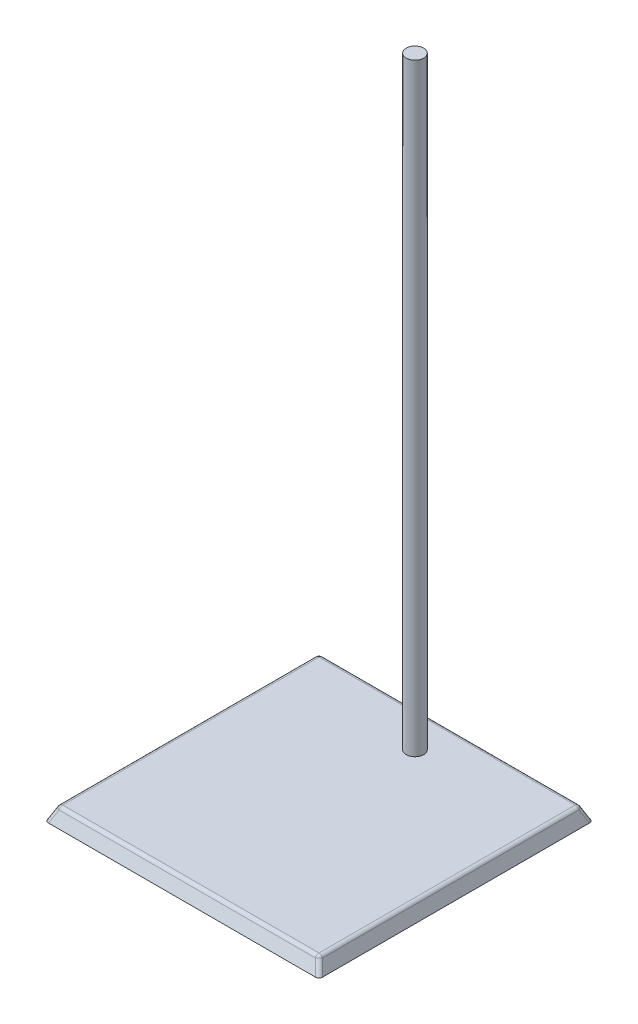
ISO-10303-21;
HEADER;
FILE_DESCRIPTION(('STEP AP214'),'2;1');
FILE_NAME('part.step','',(''),(''),'','','');
FILE_SCHEMA(('AUTOMOTIVE_DESIGN { 1 0 10303 214 1 1 1 1 }'));
ENDSEC;
DATA;
#1=APPLICATION_CONTEXT('core data for automotive mechanical design processes');
#2=APPLICATION_PROTOCOL_DEFINITION('international standard','automotive_design',2000,#1);
#3=PRODUCT_CONTEXT('',#1,'mechanical');
#4=PRODUCT('Part','Part','',(#3));
#5=PRODUCT_RELATED_PRODUCT_CATEGORY('part','',(#4));
#6=PRODUCT_DEFINITION_FORMATION('','',#4);
#7=PRODUCT_DEFINITION_CONTEXT('part definition',#1,'design');
#8=PRODUCT_DEFINITION('design','',#6,#7);
#9=PRODUCT_DEFINITION_SHAPE('','',#8);
#10=(LENGTH_UNIT() NAMED_UNIT(*) SI_UNIT(.MILLI.,.METRE.));
#11=(NAMED_UNIT(*) PLANE_ANGLE_UNIT() SI_UNIT($,.RADIAN.));
#12=(NAMED_UNIT(*) SI_UNIT($,.STERADIAN.) SOLID_ANGLE_UNIT());
#13=UNCERTAINTY_MEASURE_WITH_UNIT(LENGTH_MEASURE(1.E-05),#10,'distance_accuracy_value','');
#14=(GEOMETRIC_REPRESENTATION_CONTEXT(3) GLOBAL_UNCERTAINTY_ASSIGNED_CONTEXT((#13)) GLOBAL_UNIT_ASSIGNED_CONTEXT((#10,
#11,#12)) REPRESENTATION_CONTEXT('',''));
#15=CARTESIAN_POINT('',(0.,0.,0.));
#16=DIRECTION('',(0.,0.,1.));
#17=DIRECTION('',(1.,0.,0.));
#18=AXIS2_PLACEMENT_3D('',#15,#16,#17);
#19=CARTESIAN_POINT('',(0.,450.,0.));
#20=DIRECTION('',(0.,-1.,0.));
#21=DIRECTION('',(0.,0.,-1.));
#22=AXIS2_PLACEMENT_3D('',#19,#20,#21);
#23=CYLINDRICAL_SURFACE('',#22,6.35);
#24=CARTESIAN_POINT('',(0.,10.,0.));
#25=DIRECTION('',(0.,1.,0.));
#26=DIRECTION('',(0.,0.,1.));
#27=AXIS2_PLACEMENT_3D('',#24,#25,#26);
#28=CIRCLE('',#27,6.35);
#29=CARTESIAN_POINT('',(0.,10.,6.35));
#30=VERTEX_POINT('',#29);
#31=EDGE_CURVE('E154',#30,#30,#28,.T.);
#32=ORIENTED_EDGE('',*,*,#31,.T.);
#33=EDGE_LOOP('',(#32));
#34=FACE_BOUND('',#33,.T.);
#35=CARTESIAN_POINT('',(0.,450.,0.));
#36=DIRECTION('',(0.,1.,0.));
#37=DIRECTION('',(0.,0.,1.));
#38=AXIS2_PLACEMENT_3D('',#35,#36,#37);
#39=CIRCLE('',#38,6.35);
#40=CARTESIAN_POINT('',(0.,450.,6.35));
#41=VERTEX_POINT('',#40);
#42=EDGE_CURVE('E155',#41,#41,#39,.T.);
#43=ORIENTED_EDGE('',*,*,#42,.F.);
#44=EDGE_LOOP('',(#43));
#45=FACE_BOUND('',#44,.T.);
#46=ADVANCED_FACE('F35',(#34,#45),#23,.T.);
#47=CARTESIAN_POINT('',(0.,450.,0.));
#48=DIRECTION('',(0.,1.,0.));
#49=DIRECTION('',(0.,0.,1.));
#50=AXIS2_PLACEMENT_3D('',#47,#48,#49);
#51=PLANE('',#50);
#52=ORIENTED_EDGE('',*,*,#42,.T.);
#53=EDGE_LOOP('',(#52));
#54=FACE_BOUND('',#53,.T.);
#55=ADVANCED_FACE('F269',(#54),#51,.T.);
#56=CARTESIAN_POINT('',(0.,10.,0.));
#57=DIRECTION('',(0.,1.,0.));
#58=DIRECTION('',(0.,0.,1.));
#59=AXIS2_PLACEMENT_3D('',#56,#57,#58);
#60=PLANE('',#59);
#61=DIRECTION('',(0.,0.,-1.));
#62=VECTOR('',#61,1.);
#63=CARTESIAN_POINT('',(93.4257126360275,10.,0.));
#64=LINE('',#63,#62);
#65=CARTESIAN_POINT('',(93.4257126360275,10.,163.425712636027));
#66=VERTEX_POINT('',#65);
#67=CARTESIAN_POINT('',(93.4257126360275,10.,-23.4257126360276));
#68=VERTEX_POINT('',#67);
#69=EDGE_CURVE('E181',#66,#68,#64,.T.);
#70=ORIENTED_EDGE('',*,*,#69,.T.);
#71=DIRECTION('',(-1.,0.,0.));
#72=VECTOR('',#71,1.);
#73=CARTESIAN_POINT('',(0.,10.,-23.4257126360275));
#74=LINE('',#73,#72);
#75=CARTESIAN_POINT('',(-93.4257126360275,10.,-23.4257126360275));
#76=VERTEX_POINT('',#75);
#77=EDGE_CURVE('E11',#68,#76,#74,.T.);
#78=ORIENTED_EDGE('',*,*,#77,.T.);
#79=DIRECTION('',(0.,0.,1.));
#80=VECTOR('',#79,1.);
#81=CARTESIAN_POINT('',(-93.4257126360275,10.,0.));
#82=LINE('',#81,#80);
#83=CARTESIAN_POINT('',(-93.4257126360275,10.,163.425712636028));
#84=VERTEX_POINT('',#83);
#85=EDGE_CURVE('E44',#76,#84,#82,.T.);
#86=ORIENTED_EDGE('',*,*,#85,.T.);
#87=DIRECTION('',(1.,0.,0.));
#88=VECTOR('',#87,1.);
#89=CARTESIAN_POINT('',(0.,10.,163.425712636028));
#90=LINE('',#89,#88);
#91=EDGE_CURVE('E183',#84,#66,#90,.T.);
#92=ORIENTED_EDGE('',*,*,#91,.T.);
#93=EDGE_LOOP('',(#70,#78,#86,#92));
#94=FACE_BOUND('',#93,.T.);
#95=ORIENTED_EDGE('',*,*,#31,.F.);
#96=EDGE_LOOP('',(#95));
#97=FACE_BOUND('',#96,.T.);
#98=ADVANCED_FACE('F243',(#94,#97),#60,.T.);
#99=CARTESIAN_POINT('',(0.,0.,0.));
#100=DIRECTION('',(0.,1.,0.));
#101=DIRECTION('',(0.,0.,1.));
#102=AXIS2_PLACEMENT_3D('',#99,#100,#101);
#103=PLANE('',#102);
#104=DIRECTION('',(0.,0.,1.));
#105=VECTOR('',#104,1.);
#106=CARTESIAN_POINT('',(-100.,0.,170.));
#107=LINE('',#106,#105);
#108=CARTESIAN_POINT('',(-100.,0.,-27.28107663889));
#109=VERTEX_POINT('',#108);
#110=CARTESIAN_POINT('',(-100.,0.,167.28107663889));
#111=VERTEX_POINT('',#110);
#112=EDGE_CURVE('E131',#109,#111,#107,.T.);
#113=ORIENTED_EDGE('',*,*,#112,.F.);
#114=CARTESIAN_POINT('',(-96.6898662431125,0.,-26.6898662431125));
#115=DIRECTION('',(0.,1.,0.));
#116=DIRECTION('',(-0.707106781186548,0.,-0.707106781186547));
#117=AXIS2_PLACEMENT_3D('',#114,#115,#116);
#118=ELLIPSE('',#117,3.59360139372356,3.);
#119=CARTESIAN_POINT('',(-97.28107663889,0.,-30.));
#120=VERTEX_POINT('',#119);
#121=EDGE_CURVE('E115',#109,#120,#118,.F.);
#122=ORIENTED_EDGE('',*,*,#121,.T.);
#123=DIRECTION('',(-1.,0.,0.));
#124=VECTOR('',#123,1.);
#125=CARTESIAN_POINT('',(100.,0.,-30.));
#126=LINE('',#125,#124);
#127=CARTESIAN_POINT('',(97.28107663889,0.,-30.));
#128=VERTEX_POINT('',#127);
#129=EDGE_CURVE('E152',#128,#120,#126,.T.);
#130=ORIENTED_EDGE('',*,*,#129,.F.);
#131=CARTESIAN_POINT('',(96.6898662431125,0.,-26.6898662431125));
#132=DIRECTION('',(0.,1.,0.));
#133=DIRECTION('',(0.707106781186547,0.,-0.707106781186548));
#134=AXIS2_PLACEMENT_3D('',#131,#132,#133);
#135=ELLIPSE('',#134,3.59360139372356,3.);
#136=CARTESIAN_POINT('',(100.,0.,-27.2810766388901));
#137=VERTEX_POINT('',#136);
#138=EDGE_CURVE('E126',#128,#137,#135,.F.);
#139=ORIENTED_EDGE('',*,*,#138,.T.);
#140=DIRECTION('',(0.,0.,-1.));
#141=VECTOR('',#140,1.);
#142=CARTESIAN_POINT('',(100.,0.,170.));
#143=LINE('',#142,#141);
#144=CARTESIAN_POINT('',(100.,0.,167.28107663889));
#145=VERTEX_POINT('',#144);
#146=EDGE_CURVE('E145',#145,#137,#143,.T.);
#147=ORIENTED_EDGE('',*,*,#146,.F.);
#148=CARTESIAN_POINT('',(96.6898662431125,0.,166.689866243113));
#149=DIRECTION('',(0.,1.,0.));
#150=DIRECTION('',(-0.707106781186548,0.,-0.707106781186547));
#151=AXIS2_PLACEMENT_3D('',#148,#149,#150);
#152=ELLIPSE('',#151,3.59360139372356,3.);
#153=CARTESIAN_POINT('',(97.28107663889,0.,170.));
#154=VERTEX_POINT('',#153);
#155=EDGE_CURVE('E135',#145,#154,#152,.F.);
#156=ORIENTED_EDGE('',*,*,#155,.T.);
#157=DIRECTION('',(1.,0.,0.));
#158=VECTOR('',#157,1.);
#159=CARTESIAN_POINT('',(100.,0.,170.));
#160=LINE('',#159,#158);
#161=CARTESIAN_POINT('',(-97.28107663889,0.,170.));
#162=VERTEX_POINT('',#161);
#163=EDGE_CURVE('E142',#162,#154,#160,.T.);
#164=ORIENTED_EDGE('',*,*,#163,.F.);
#165=CARTESIAN_POINT('',(-96.6898662431125,0.,166.689866243113));
#166=DIRECTION('',(0.,1.,0.));
#167=DIRECTION('',(0.707106781186547,0.,-0.707106781186548));
#168=AXIS2_PLACEMENT_3D('',#165,#166,#167);
#169=ELLIPSE('',#168,3.59360139372356,3.);
#170=EDGE_CURVE('E141',#162,#111,#169,.F.);
#171=ORIENTED_EDGE('',*,*,#170,.T.);
#172=EDGE_LOOP('',(#113,#122,#130,#139,#147,#156,#164,#171));
#173=FACE_BOUND('',#172,.T.);
#174=ADVANCED_FACE('F138',(#173),#103,.F.);
#175=CARTESIAN_POINT('',(95.33692341845,10.,0.));
#176=DIRECTION('',(0.906307787036651,0.422618261740697,0.));
#177=DIRECTION('',(0.,0.,1.));
#178=AXIS2_PLACEMENT_3D('',#175,#176,#177);
#179=PLANE('',#178);
#180=ORIENTED_EDGE('',*,*,#146,.T.);
#181=DIRECTION('',(0.389281620635024,-0.834817129478989,-0.389281620635024));
#182=VECTOR('',#181,1.);
#183=CARTESIAN_POINT('',(91.9093876148061,17.3503742512087,-19.1904642536962));
#184=LINE('',#183,#182);
#185=CARTESIAN_POINT('',(96.1446359971375,8.2678547852221,-23.4257126360276));
#186=VERTEX_POINT('',#185);
#187=EDGE_CURVE('E173',#137,#186,#184,.F.);
#188=ORIENTED_EDGE('',*,*,#187,.T.);
#189=DIRECTION('',(0.,0.,-1.));
#190=VECTOR('',#189,1.);
#191=CARTESIAN_POINT('',(96.1446359971375,8.2678547852221,0.));
#192=LINE('',#191,#190);
#193=CARTESIAN_POINT('',(96.1446359971375,8.2678547852221,163.425712636028));
#194=VERTEX_POINT('',#193);
#195=EDGE_CURVE('E169',#186,#194,#192,.F.);
#196=ORIENTED_EDGE('',*,*,#195,.T.);
#197=DIRECTION('',(-0.389281620635023,0.834817129478989,-0.389281620635023));
#198=VECTOR('',#197,1.);
#199=CARTESIAN_POINT('',(70.6937623918139,62.8474293648529,137.974839030704));
#200=LINE('',#199,#198);
#201=EDGE_CURVE('E171',#194,#145,#200,.F.);
#202=ORIENTED_EDGE('',*,*,#201,.T.);
#203=EDGE_LOOP('',(#180,#188,#196,#202));
#204=FACE_BOUND('',#203,.T.);
#205=ADVANCED_FACE('F230',(#204),#179,.T.);
#206=CARTESIAN_POINT('',(0.,10.,-25.33692341845));
#207=DIRECTION('',(0.,0.422618261740697,-0.906307787036651));
#208=DIRECTION('',(1.,0.,0.));
#209=AXIS2_PLACEMENT_3D('',#206,#207,#208);
#210=PLANE('',#209);
#211=ORIENTED_EDGE('',*,*,#129,.T.);
#212=DIRECTION('',(-0.389281620635023,-0.834817129478989,-0.389281620635023));
#213=VECTOR('',#212,1.);
#214=CARTESIAN_POINT('',(-78.5826516422001,40.0989018080308,-11.30157500331));
#215=LINE('',#214,#213);
#216=CARTESIAN_POINT('',(-93.4257126360275,8.26785478522209,-26.1446359971375));
#217=VERTEX_POINT('',#216);
#218=EDGE_CURVE('E120',#120,#217,#215,.F.);
#219=ORIENTED_EDGE('',*,*,#218,.T.);
#220=DIRECTION('',(-1.,0.,0.));
#221=VECTOR('',#220,1.);
#222=CARTESIAN_POINT('',(0.,8.26785478522209,-26.1446359971375));
#223=LINE('',#222,#221);
#224=CARTESIAN_POINT('',(93.4257126360275,8.26785478522209,-26.1446359971375));
#225=VERTEX_POINT('',#224);
#226=EDGE_CURVE('E125',#217,#225,#223,.F.);
#227=ORIENTED_EDGE('',*,*,#226,.T.);
#228=DIRECTION('',(0.389281620635024,-0.834817129478989,-0.389281620635024));
#229=VECTOR('',#228,1.);
#230=CARTESIAN_POINT('',(78.5826516422001,40.0989018080308,-11.30157500331));
#231=LINE('',#230,#229);
#232=EDGE_CURVE('E166',#225,#128,#231,.T.);
#233=ORIENTED_EDGE('',*,*,#232,.T.);
#234=EDGE_LOOP('',(#211,#219,#227,#233));
#235=FACE_BOUND('',#234,.T.);
#236=ADVANCED_FACE('F284',(#235),#210,.T.);
#237=CARTESIAN_POINT('',(0.,10.,165.33692341845));
#238=DIRECTION('',(0.,0.422618261740697,0.906307787036651));
#239=DIRECTION('',(-1.,0.,0.));
#240=AXIS2_PLACEMENT_3D('',#237,#238,#239);
#241=PLANE('',#240);
#242=DIRECTION('',(1.,0.,0.));
#243=VECTOR('',#242,1.);
#244=CARTESIAN_POINT('',(0.,8.2678547852221,166.144635997138));
#245=LINE('',#244,#243);
#246=CARTESIAN_POINT('',(93.4257126360275,8.2678547852221,166.144635997137));
#247=VERTEX_POINT('',#246);
#248=CARTESIAN_POINT('',(-93.4257126360276,8.2678547852221,166.144635997138));
#249=VERTEX_POINT('',#248);
#250=EDGE_CURVE('E175',#247,#249,#245,.F.);
#251=ORIENTED_EDGE('',*,*,#250,.T.);
#252=DIRECTION('',(0.389281620635023,0.834817129478989,-0.389281620635024));
#253=VECTOR('',#252,1.);
#254=CARTESIAN_POINT('',(-78.5826516422001,40.0989018080308,151.30157500331));
#255=LINE('',#254,#253);
#256=EDGE_CURVE('E179',#249,#162,#255,.F.);
#257=ORIENTED_EDGE('',*,*,#256,.T.);
#258=ORIENTED_EDGE('',*,*,#163,.T.);
#259=DIRECTION('',(-0.389281620635023,0.834817129478989,-0.389281620635023));
#260=VECTOR('',#259,1.);
#261=CARTESIAN_POINT('',(78.5826516422001,40.0989018080308,151.30157500331));
#262=LINE('',#261,#260);
#263=EDGE_CURVE('E177',#154,#247,#262,.T.);
#264=ORIENTED_EDGE('',*,*,#263,.T.);
#265=EDGE_LOOP('',(#251,#257,#258,#264));
#266=FACE_BOUND('',#265,.T.);
#267=ADVANCED_FACE('F250',(#266),#241,.T.);
#268=CARTESIAN_POINT('',(-95.33692341845,10.,0.));
#269=DIRECTION('',(-0.906307787036651,0.422618261740697,0.));
#270=DIRECTION('',(0.,0.,-1.));
#271=AXIS2_PLACEMENT_3D('',#268,#269,#270);
#272=PLANE('',#271);
#273=DIRECTION('',(0.,0.,1.));
#274=VECTOR('',#273,1.);
#275=CARTESIAN_POINT('',(-96.1446359971375,8.2678547852221,0.));
#276=LINE('',#275,#274);
#277=CARTESIAN_POINT('',(-96.1446359971375,8.2678547852221,163.425712636028));
#278=VERTEX_POINT('',#277);
#279=CARTESIAN_POINT('',(-96.1446359971375,8.2678547852221,-23.4257126360275));
#280=VERTEX_POINT('',#279);
#281=EDGE_CURVE('E134',#278,#280,#276,.F.);
#282=ORIENTED_EDGE('',*,*,#281,.T.);
#283=DIRECTION('',(-0.389281620635023,-0.834817129478989,-0.389281620635023));
#284=VECTOR('',#283,1.);
#285=CARTESIAN_POINT('',(-91.9093876148062,17.3503742512086,-19.1904642536962));
#286=LINE('',#285,#284);
#287=EDGE_CURVE('E119',#280,#109,#286,.T.);
#288=ORIENTED_EDGE('',*,*,#287,.T.);
#289=ORIENTED_EDGE('',*,*,#112,.T.);
#290=DIRECTION('',(0.389281620635023,0.834817129478989,-0.389281620635024));
#291=VECTOR('',#290,1.);
#292=CARTESIAN_POINT('',(-70.6937623918139,62.8474293648529,137.974839030704));
#293=LINE('',#292,#291);
#294=EDGE_CURVE('E136',#111,#278,#293,.T.);
#295=ORIENTED_EDGE('',*,*,#294,.T.);
#296=EDGE_LOOP('',(#282,#288,#289,#295));
#297=FACE_BOUND('',#296,.T.);
#298=ADVANCED_FACE('F130',(#297),#272,.T.);
#299=CARTESIAN_POINT('',(78.5826516422001,38.8310470228087,148.5826516422));
#300=DIRECTION('',(-0.389281620635023,0.834817129478989,-0.389281620635023));
#301=DIRECTION('',(-0.906307787036651,-0.422618261740697,0.));
#302=AXIS2_PLACEMENT_3D('',#299,#300,#301);
#303=CYLINDRICAL_SURFACE('',#302,3.);
#304=CARTESIAN_POINT('',(93.4257126360275,7.,163.425712636028));
#305=DIRECTION('',(-0.389281620635024,0.834817129478989,-0.389281620635023));
#306=DIRECTION('',(-0.906307787036651,-0.422618261740698,0.));
#307=AXIS2_PLACEMENT_3D('',#304,#305,#306);
#308=CIRCLE('',#307,3.);
#309=EDGE_CURVE('E39',#247,#194,#308,.T.);
#310=ORIENTED_EDGE('',*,*,#309,.F.);
#311=ORIENTED_EDGE('',*,*,#263,.F.);
#312=ORIENTED_EDGE('',*,*,#155,.F.);
#313=ORIENTED_EDGE('',*,*,#201,.F.);
#314=EDGE_LOOP('',(#310,#311,#312,#313));
#315=FACE_BOUND('',#314,.T.);
#316=ADVANCED_FACE('F37',(#315),#303,.T.);
#317=CARTESIAN_POINT('',(93.4257126360276,7.,163.425712636028));
#318=DIRECTION('',(0.,0.,1.));
#319=DIRECTION('',(1.,0.,0.));
#320=AXIS2_PLACEMENT_3D('',#317,#318,#319);
#321=SPHERICAL_SURFACE('',#320,3.);
#322=CARTESIAN_POINT('',(93.4257126360275,7.,163.425712636027));
#323=DIRECTION('',(1.,0.,0.));
#324=DIRECTION('',(0.,0.,-1.));
#325=AXIS2_PLACEMENT_3D('',#322,#323,#324);
#326=CIRCLE('',#325,3.);
#327=EDGE_CURVE('E209',#247,#66,#326,.F.);
#328=ORIENTED_EDGE('',*,*,#327,.F.);
#329=ORIENTED_EDGE('',*,*,#309,.T.);
#330=CARTESIAN_POINT('',(93.4257126360275,7.00000000000001,163.425712636028));
#331=DIRECTION('',(0.,0.,1.));
#332=DIRECTION('',(0.,-1.,0.));
#333=AXIS2_PLACEMENT_3D('',#330,#331,#332);
#334=CIRCLE('',#333,3.);
#335=EDGE_CURVE('E148',#66,#194,#334,.F.);
#336=ORIENTED_EDGE('',*,*,#335,.F.);
#337=EDGE_LOOP('',(#328,#329,#336));
#338=FACE_BOUND('',#337,.T.);
#339=ADVANCED_FACE('F221',(#338),#321,.T.);
#340=CARTESIAN_POINT('',(78.5826516422001,38.8310470228087,-8.58265164220008));
#341=DIRECTION('',(0.389281620635023,-0.834817129478989,-0.389281620635024));
#342=DIRECTION('',(0.,0.422618261740697,-0.906307787036651));
#343=AXIS2_PLACEMENT_3D('',#340,#341,#342);
#344=CYLINDRICAL_SURFACE('',#343,3.);
#345=ORIENTED_EDGE('',*,*,#138,.F.);
#346=ORIENTED_EDGE('',*,*,#232,.F.);
#347=CARTESIAN_POINT('',(93.4257126360275,7.00000000000001,-23.4257126360276));
#348=DIRECTION('',(-0.389281620635023,0.83481712947899,0.389281620635023));
#349=DIRECTION('',(-0.906307787036651,-0.422618261740697,0.));
#350=AXIS2_PLACEMENT_3D('',#347,#348,#349);
#351=CIRCLE('',#350,3.);
#352=EDGE_CURVE('E206',#186,#225,#351,.T.);
#353=ORIENTED_EDGE('',*,*,#352,.F.);
#354=ORIENTED_EDGE('',*,*,#187,.F.);
#355=EDGE_LOOP('',(#345,#346,#353,#354));
#356=FACE_BOUND('',#355,.T.);
#357=ADVANCED_FACE('F235',(#356),#344,.T.);
#358=CARTESIAN_POINT('',(93.4257126360275,7.,0.));
#359=DIRECTION('',(0.,0.,-1.));
#360=DIRECTION('',(-1.,0.,0.));
#361=AXIS2_PLACEMENT_3D('',#358,#359,#360);
#362=CYLINDRICAL_SURFACE('',#361,3.);
#363=ORIENTED_EDGE('',*,*,#335,.T.);
#364=ORIENTED_EDGE('',*,*,#195,.F.);
#365=CARTESIAN_POINT('',(93.4257126360275,7.,-23.4257126360276));
#366=DIRECTION('',(0.,0.,-1.));
#367=DIRECTION('',(-1.,0.,0.));
#368=AXIS2_PLACEMENT_3D('',#365,#366,#367);
#369=CIRCLE('',#368,3.);
#370=EDGE_CURVE('E203',#68,#186,#369,.T.);
#371=ORIENTED_EDGE('',*,*,#370,.F.);
#372=ORIENTED_EDGE('',*,*,#69,.F.);
#373=EDGE_LOOP('',(#363,#364,#371,#372));
#374=FACE_BOUND('',#373,.T.);
#375=ADVANCED_FACE('F216',(#374),#362,.T.);
#376=CARTESIAN_POINT('',(0.,7.,163.425712636028));
#377=DIRECTION('',(1.,0.,0.));
#378=DIRECTION('',(0.,0.,-1.));
#379=AXIS2_PLACEMENT_3D('',#376,#377,#378);
#380=CYLINDRICAL_SURFACE('',#379,3.);
#381=ORIENTED_EDGE('',*,*,#327,.T.);
#382=ORIENTED_EDGE('',*,*,#91,.F.);
#383=CARTESIAN_POINT('',(-93.4257126360276,7.,163.425712636028));
#384=DIRECTION('',(-1.,0.,0.));
#385=DIRECTION('',(0.,-1.,0.));
#386=AXIS2_PLACEMENT_3D('',#383,#384,#385);
#387=CIRCLE('',#386,3.);
#388=EDGE_CURVE('E200',#249,#84,#387,.T.);
#389=ORIENTED_EDGE('',*,*,#388,.F.);
#390=ORIENTED_EDGE('',*,*,#250,.F.);
#391=EDGE_LOOP('',(#381,#382,#389,#390));
#392=FACE_BOUND('',#391,.T.);
#393=ADVANCED_FACE('F247',(#392),#380,.T.);
#394=CARTESIAN_POINT('',(-67.9748390307039,61.5795745796309,137.974839030704));
#395=DIRECTION('',(0.389281620635023,0.834817129478989,-0.389281620635024));
#396=DIRECTION('',(0.,0.422618261740698,0.906307787036651));
#397=AXIS2_PLACEMENT_3D('',#394,#395,#396);
#398=CYLINDRICAL_SURFACE('',#397,3.);
#399=ORIENTED_EDGE('',*,*,#170,.F.);
#400=ORIENTED_EDGE('',*,*,#256,.F.);
#401=CARTESIAN_POINT('',(-93.4257126360275,7.00000000000001,163.425712636028));
#402=DIRECTION('',(0.389281620635024,0.834817129478992,-0.389281620635015));
#403=DIRECTION('',(-0.906307787036651,0.422618261740697,0.));
#404=AXIS2_PLACEMENT_3D('',#401,#402,#403);
#405=CIRCLE('',#404,3.);
#406=EDGE_CURVE('E197',#278,#249,#405,.T.);
#407=ORIENTED_EDGE('',*,*,#406,.F.);
#408=ORIENTED_EDGE('',*,*,#294,.F.);
#409=EDGE_LOOP('',(#399,#400,#407,#408));
#410=FACE_BOUND('',#409,.T.);
#411=ADVANCED_FACE('F253',(#410),#398,.T.);
#412=CARTESIAN_POINT('',(93.4257126360276,7.,-23.4257126360276));
#413=DIRECTION('',(0.,0.,1.));
#414=DIRECTION('',(1.,0.,0.));
#415=AXIS2_PLACEMENT_3D('',#412,#413,#414);
#416=SPHERICAL_SURFACE('',#415,3.);
#417=ORIENTED_EDGE('',*,*,#370,.T.);
#418=ORIENTED_EDGE('',*,*,#352,.T.);
#419=CARTESIAN_POINT('',(93.4257126360275,7.,-23.4257126360276));
#420=DIRECTION('',(1.,0.,0.));
#421=DIRECTION('',(0.,0.,-1.));
#422=AXIS2_PLACEMENT_3D('',#419,#420,#421);
#423=CIRCLE('',#422,3.);
#424=EDGE_CURVE('E194',#68,#225,#423,.F.);
#425=ORIENTED_EDGE('',*,*,#424,.F.);
#426=EDGE_LOOP('',(#417,#418,#425));
#427=FACE_BOUND('',#426,.T.);
#428=ADVANCED_FACE('F238',(#427),#416,.T.);
#429=CARTESIAN_POINT('',(-93.4257126360276,7.,163.425712636028));
#430=DIRECTION('',(0.,0.,1.));
#431=DIRECTION('',(1.,0.,0.));
#432=AXIS2_PLACEMENT_3D('',#429,#430,#431);
#433=SPHERICAL_SURFACE('',#432,3.);
#434=ORIENTED_EDGE('',*,*,#406,.T.);
#435=ORIENTED_EDGE('',*,*,#388,.T.);
#436=CARTESIAN_POINT('',(-93.4257126360275,7.,163.425712636028));
#437=DIRECTION('',(0.,0.,1.));
#438=DIRECTION('',(1.,0.,0.));
#439=AXIS2_PLACEMENT_3D('',#436,#437,#438);
#440=CIRCLE('',#439,3.);
#441=EDGE_CURVE('E191',#278,#84,#440,.F.);
#442=ORIENTED_EDGE('',*,*,#441,.F.);
#443=EDGE_LOOP('',(#434,#435,#442));
#444=FACE_BOUND('',#443,.T.);
#445=ADVANCED_FACE('F256',(#444),#433,.T.);
#446=CARTESIAN_POINT('',(0.,7.,-23.4257126360275));
#447=DIRECTION('',(-1.,0.,0.));
#448=DIRECTION('',(0.,0.,1.));
#449=AXIS2_PLACEMENT_3D('',#446,#447,#448);
#450=CYLINDRICAL_SURFACE('',#449,3.);
#451=ORIENTED_EDGE('',*,*,#424,.T.);
#452=ORIENTED_EDGE('',*,*,#226,.F.);
#453=CARTESIAN_POINT('',(-93.4257126360275,7.,-23.4257126360275));
#454=DIRECTION('',(-1.,0.,0.));
#455=DIRECTION('',(0.,0.,1.));
#456=AXIS2_PLACEMENT_3D('',#453,#454,#455);
#457=CIRCLE('',#456,3.);
#458=EDGE_CURVE('E189',#76,#217,#457,.T.);
#459=ORIENTED_EDGE('',*,*,#458,.F.);
#460=ORIENTED_EDGE('',*,*,#77,.F.);
#461=EDGE_LOOP('',(#451,#452,#459,#460));
#462=FACE_BOUND('',#461,.T.);
#463=ADVANCED_FACE('F242',(#462),#450,.T.);
#464=CARTESIAN_POINT('',(-93.4257126360275,7.,0.));
#465=DIRECTION('',(0.,0.,1.));
#466=DIRECTION('',(1.,0.,0.));
#467=AXIS2_PLACEMENT_3D('',#464,#465,#466);
#468=CYLINDRICAL_SURFACE('',#467,3.);
#469=ORIENTED_EDGE('',*,*,#441,.T.);
#470=ORIENTED_EDGE('',*,*,#85,.F.);
#471=CARTESIAN_POINT('',(-93.4257126360275,7.00000000000001,-23.4257126360275));
#472=DIRECTION('',(0.,0.,-1.));
#473=DIRECTION('',(0.,1.,0.));
#474=AXIS2_PLACEMENT_3D('',#471,#472,#473);
#475=CIRCLE('',#474,3.);
#476=EDGE_CURVE('E52',#280,#76,#475,.T.);
#477=ORIENTED_EDGE('',*,*,#476,.F.);
#478=ORIENTED_EDGE('',*,*,#281,.F.);
#479=EDGE_LOOP('',(#469,#470,#477,#478));
#480=FACE_BOUND('',#479,.T.);
#481=ADVANCED_FACE('F258',(#480),#468,.T.);
#482=CARTESIAN_POINT('',(-93.4257126360275,7.,-23.4257126360275));
#483=DIRECTION('',(0.,0.,1.));
#484=DIRECTION('',(1.,0.,0.));
#485=AXIS2_PLACEMENT_3D('',#482,#483,#484);
#486=SPHERICAL_SURFACE('',#485,3.);
#487=ORIENTED_EDGE('',*,*,#476,.T.);
#488=ORIENTED_EDGE('',*,*,#458,.T.);
#489=CARTESIAN_POINT('',(-93.4257126360275,7.,-23.4257126360275));
#490=DIRECTION('',(0.389281620635024,0.834817129478989,0.389281620635023));
#491=DIRECTION('',(-0.90630778703665,0.422618261740698,0.));
#492=AXIS2_PLACEMENT_3D('',#489,#490,#491);
#493=CIRCLE('',#492,3.);
#494=EDGE_CURVE('E186',#280,#217,#493,.F.);
#495=ORIENTED_EDGE('',*,*,#494,.F.);
#496=EDGE_LOOP('',(#487,#488,#495));
#497=FACE_BOUND('',#496,.T.);
#498=ADVANCED_FACE('F259',(#497),#486,.T.);
#499=CARTESIAN_POINT('',(-89.1904642536962,16.0825194659866,-19.1904642536962));
#500=DIRECTION('',(-0.389281620635023,-0.834817129478989,-0.389281620635023));
#501=DIRECTION('',(0.906307787036651,-0.422618261740697,0.));
#502=AXIS2_PLACEMENT_3D('',#499,#500,#501);
#503=CYLINDRICAL_SURFACE('',#502,3.);
#504=ORIENTED_EDGE('',*,*,#494,.T.);
#505=ORIENTED_EDGE('',*,*,#218,.F.);
#506=ORIENTED_EDGE('',*,*,#121,.F.);
#507=ORIENTED_EDGE('',*,*,#287,.F.);
#508=EDGE_LOOP('',(#504,#505,#506,#507));
#509=FACE_BOUND('',#508,.T.);
#510=ADVANCED_FACE('F118',(#509),#503,.T.);
#511=CLOSED_SHELL('',(#46,#55,#98,#174,#205,#236,#267,#298,#316,#339,#357,#375,#393,#411,#428,
#445,#463,#481,#498,#510));
#512=MANIFOLD_SOLID_BREP('B2',#511);
#513=ADVANCED_BREP_SHAPE_REPRESENTATION('',(#18,#512),#14);
#514=SHAPE_DEFINITION_REPRESENTATION(#9,#513);
ENDSEC;
END-ISO-10303-21;
